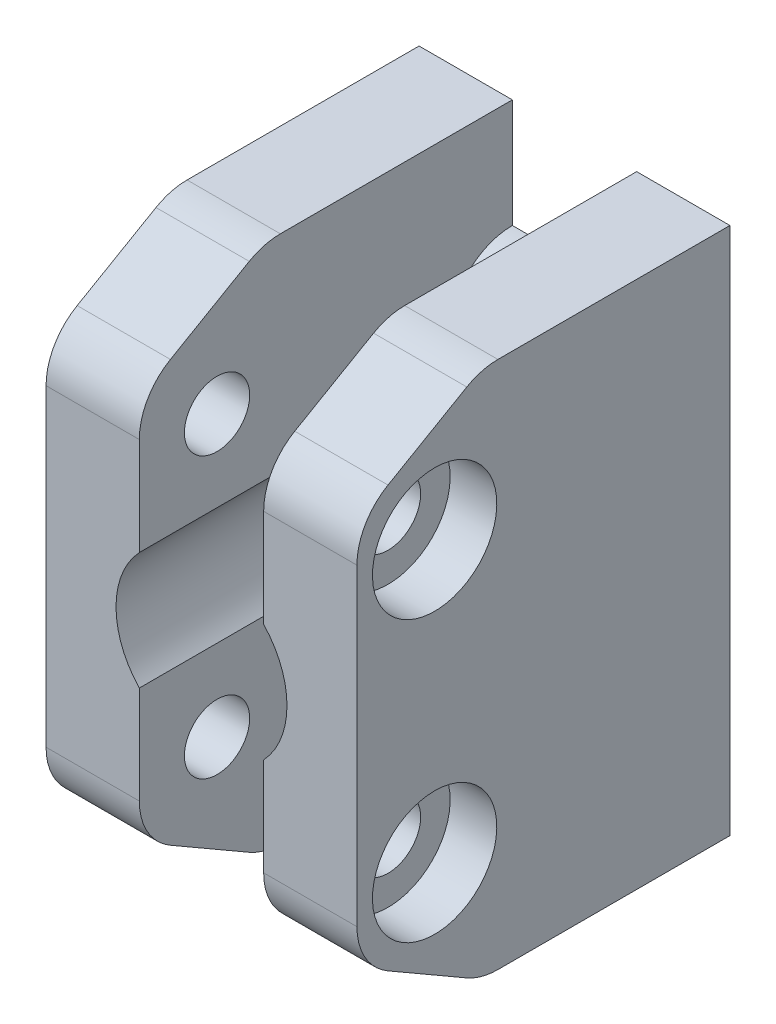
ISO-10303-21;
HEADER;
FILE_DESCRIPTION(('STEP AP214'),'2;1');
FILE_NAME('part.step','',(''),(''),'','','');
FILE_SCHEMA(('AUTOMOTIVE_DESIGN { 1 0 10303 214 1 1 1 1 }'));
ENDSEC;
DATA;
#1=APPLICATION_CONTEXT('core data for automotive mechanical design processes');
#2=APPLICATION_PROTOCOL_DEFINITION('international standard','automotive_design',2000,#1);
#3=PRODUCT_CONTEXT('',#1,'mechanical');
#4=PRODUCT('Part','Part','',(#3));
#5=PRODUCT_RELATED_PRODUCT_CATEGORY('part','',(#4));
#6=PRODUCT_DEFINITION_FORMATION('','',#4);
#7=PRODUCT_DEFINITION_CONTEXT('part definition',#1,'design');
#8=PRODUCT_DEFINITION('design','',#6,#7);
#9=PRODUCT_DEFINITION_SHAPE('','',#8);
#10=(LENGTH_UNIT() NAMED_UNIT(*) SI_UNIT(.MILLI.,.METRE.));
#11=(NAMED_UNIT(*) PLANE_ANGLE_UNIT() SI_UNIT($,.RADIAN.));
#12=(NAMED_UNIT(*) SI_UNIT($,.STERADIAN.) SOLID_ANGLE_UNIT());
#13=UNCERTAINTY_MEASURE_WITH_UNIT(LENGTH_MEASURE(1.E-05),#10,'distance_accuracy_value','');
#14=(GEOMETRIC_REPRESENTATION_CONTEXT(3) GLOBAL_UNCERTAINTY_ASSIGNED_CONTEXT((#13)) GLOBAL_UNIT_ASSIGNED_CONTEXT((#10,
#11,#12)) REPRESENTATION_CONTEXT('',''));
#15=CARTESIAN_POINT('',(0.,0.,0.));
#16=DIRECTION('',(0.,0.,1.));
#17=DIRECTION('',(1.,0.,0.));
#18=AXIS2_PLACEMENT_3D('',#15,#16,#17);
#19=CARTESIAN_POINT('',(-10.,-9.,19.));
#20=DIRECTION('',(1.,0.,0.));
#21=DIRECTION('',(0.,1.,0.));
#22=AXIS2_PLACEMENT_3D('',#19,#20,#21);
#23=CYLINDRICAL_SURFACE('',#22,2.1);
#24=CARTESIAN_POINT('',(4.,-9.,19.));
#25=DIRECTION('',(1.,0.,0.));
#26=DIRECTION('',(0.,1.,0.));
#27=AXIS2_PLACEMENT_3D('',#24,#25,#26);
#28=CIRCLE('',#27,2.1);
#29=CARTESIAN_POINT('',(4.,-6.9,19.));
#30=VERTEX_POINT('',#29);
#31=EDGE_CURVE('E333',#30,#30,#28,.T.);
#32=ORIENTED_EDGE('',*,*,#31,.F.);
#33=EDGE_LOOP('',(#32));
#34=FACE_BOUND('',#33,.T.);
#35=CARTESIAN_POINT('',(7.,-9.,19.));
#36=DIRECTION('',(1.,0.,0.));
#37=DIRECTION('',(0.,1.,0.));
#38=AXIS2_PLACEMENT_3D('',#35,#36,#37);
#39=CIRCLE('',#38,2.1);
#40=CARTESIAN_POINT('',(7.,-6.9,19.));
#41=VERTEX_POINT('',#40);
#42=EDGE_CURVE('E38',#41,#41,#39,.F.);
#43=ORIENTED_EDGE('',*,*,#42,.F.);
#44=EDGE_LOOP('',(#43));
#45=FACE_BOUND('',#44,.T.);
#46=ADVANCED_FACE('F34',(#34,#45),#23,.F.);
#47=CARTESIAN_POINT('',(-10.,9.,19.));
#48=DIRECTION('',(1.,0.,0.));
#49=DIRECTION('',(0.,1.,0.));
#50=AXIS2_PLACEMENT_3D('',#47,#48,#49);
#51=CYLINDRICAL_SURFACE('',#50,2.1);
#52=CARTESIAN_POINT('',(4.,9.,19.));
#53=DIRECTION('',(1.,0.,0.));
#54=DIRECTION('',(0.,1.,0.));
#55=AXIS2_PLACEMENT_3D('',#52,#53,#54);
#56=CIRCLE('',#55,2.1);
#57=CARTESIAN_POINT('',(4.,11.1,19.));
#58=VERTEX_POINT('',#57);
#59=EDGE_CURVE('E329',#58,#58,#56,.T.);
#60=ORIENTED_EDGE('',*,*,#59,.F.);
#61=EDGE_LOOP('',(#60));
#62=FACE_BOUND('',#61,.T.);
#63=CARTESIAN_POINT('',(7.,9.,19.));
#64=DIRECTION('',(1.,0.,0.));
#65=DIRECTION('',(0.,1.,0.));
#66=AXIS2_PLACEMENT_3D('',#63,#64,#65);
#67=CIRCLE('',#66,2.1);
#68=CARTESIAN_POINT('',(7.,11.1,19.));
#69=VERTEX_POINT('',#68);
#70=EDGE_CURVE('E239',#69,#69,#67,.F.);
#71=ORIENTED_EDGE('',*,*,#70,.F.);
#72=EDGE_LOOP('',(#71));
#73=FACE_BOUND('',#72,.T.);
#74=ADVANCED_FACE('F573',(#62,#73),#51,.F.);
#75=CARTESIAN_POINT('',(-4.,17.,0.));
#76=DIRECTION('',(-1.,0.,0.));
#77=DIRECTION('',(0.,0.,1.));
#78=AXIS2_PLACEMENT_3D('',#75,#76,#77);
#79=PLANE('',#78);
#80=CARTESIAN_POINT('',(-4.,9.,19.));
#81=DIRECTION('',(-1.,0.,0.));
#82=DIRECTION('',(0.,0.,1.));
#83=AXIS2_PLACEMENT_3D('',#80,#81,#82);
#84=CIRCLE('',#83,2.1);
#85=CARTESIAN_POINT('',(-4.,9.,21.1));
#86=VERTEX_POINT('',#85);
#87=EDGE_CURVE('E249',#86,#86,#84,.T.);
#88=ORIENTED_EDGE('',*,*,#87,.T.);
#89=EDGE_LOOP('',(#88));
#90=FACE_BOUND('',#89,.T.);
#91=DIRECTION('',(0.,0.,-1.));
#92=VECTOR('',#91,1.);
#93=CARTESIAN_POINT('',(-4.,3.77491721763537,24.));
#94=LINE('',#93,#92);
#95=CARTESIAN_POINT('',(-4.,3.77491721763537,4.));
#96=VERTEX_POINT('',#95);
#97=CARTESIAN_POINT('',(-4.,3.77491721763537,24.));
#98=VERTEX_POINT('',#97);
#99=EDGE_CURVE('E51',#96,#98,#94,.F.);
#100=ORIENTED_EDGE('',*,*,#99,.F.);
#101=DIRECTION('',(0.,1.,0.));
#102=VECTOR('',#101,1.);
#103=CARTESIAN_POINT('',(-4.,17.,4.));
#104=LINE('',#103,#102);
#105=CARTESIAN_POINT('',(-4.,6.,4.));
#106=VERTEX_POINT('',#105);
#107=EDGE_CURVE('E264',#96,#106,#104,.T.);
#108=ORIENTED_EDGE('',*,*,#107,.T.);
#109=CARTESIAN_POINT('',(-4.,6.,0.));
#110=DIRECTION('',(-1.,0.,0.));
#111=DIRECTION('',(0.,0.,1.));
#112=AXIS2_PLACEMENT_3D('',#109,#110,#111);
#113=CIRCLE('',#112,4.);
#114=CARTESIAN_POINT('',(-4.,10.,0.));
#115=VERTEX_POINT('',#114);
#116=EDGE_CURVE('E326',#106,#115,#113,.T.);
#117=ORIENTED_EDGE('',*,*,#116,.T.);
#118=DIRECTION('',(0.,-1.,0.));
#119=VECTOR('',#118,1.);
#120=CARTESIAN_POINT('',(-4.,17.,0.));
#121=LINE('',#120,#119);
#122=CARTESIAN_POINT('',(-4.,17.,0.));
#123=VERTEX_POINT('',#122);
#124=EDGE_CURVE('E277',#123,#115,#121,.T.);
#125=ORIENTED_EDGE('',*,*,#124,.F.);
#126=DIRECTION('',(0.,0.,1.));
#127=VECTOR('',#126,1.);
#128=CARTESIAN_POINT('',(-4.,17.,0.));
#129=LINE('',#128,#127);
#130=CARTESIAN_POINT('',(-4.,17.,14.9282032302755));
#131=VERTEX_POINT('',#130);
#132=EDGE_CURVE('E289',#123,#131,#129,.T.);
#133=ORIENTED_EDGE('',*,*,#132,.T.);
#134=CARTESIAN_POINT('',(-4.,13.,14.9282032302755));
#135=DIRECTION('',(-1.,0.,0.));
#136=DIRECTION('',(0.,0.,1.));
#137=AXIS2_PLACEMENT_3D('',#134,#135,#136);
#138=CIRCLE('',#137,4.);
#139=CARTESIAN_POINT('',(-4.,16.4641016151378,16.9282032302754));
#140=VERTEX_POINT('',#139);
#141=EDGE_CURVE('E395',#131,#140,#138,.F.);
#142=ORIENTED_EDGE('',*,*,#141,.T.);
#143=DIRECTION('',(0.,-0.499999999999998,0.86602540378444));
#144=VECTOR('',#143,1.);
#145=CARTESIAN_POINT('',(-4.,12.381197846483,24.));
#146=LINE('',#145,#144);
#147=CARTESIAN_POINT('',(-4.,13.5358983848622,22.));
#148=VERTEX_POINT('',#147);
#149=EDGE_CURVE('E328',#140,#148,#146,.T.);
#150=ORIENTED_EDGE('',*,*,#149,.T.);
#151=CARTESIAN_POINT('',(-4.,10.0717967697245,20.));
#152=DIRECTION('',(-1.,0.,0.));
#153=DIRECTION('',(0.,0.,1.));
#154=AXIS2_PLACEMENT_3D('',#151,#152,#153);
#155=CIRCLE('',#154,4.);
#156=CARTESIAN_POINT('',(-4.,10.0717967697245,24.));
#157=VERTEX_POINT('',#156);
#158=EDGE_CURVE('E392',#148,#157,#155,.F.);
#159=ORIENTED_EDGE('',*,*,#158,.T.);
#160=DIRECTION('',(0.,1.,0.));
#161=VECTOR('',#160,1.);
#162=CARTESIAN_POINT('',(-4.,17.,24.));
#163=LINE('',#162,#161);
#164=EDGE_CURVE('E256',#98,#157,#163,.T.);
#165=ORIENTED_EDGE('',*,*,#164,.F.);
#166=EDGE_LOOP('',(#100,#108,#117,#125,#133,#142,#150,#159,#165));
#167=FACE_BOUND('',#166,.T.);
#168=ADVANCED_FACE('F472',(#90,#167),#79,.F.);
#169=CARTESIAN_POINT('',(-4.,-9.,19.));
#170=DIRECTION('',(-1.,0.,0.));
#171=DIRECTION('',(0.,0.,1.));
#172=AXIS2_PLACEMENT_3D('',#169,#170,#171);
#173=CIRCLE('',#172,2.1);
#174=CARTESIAN_POINT('',(-4.,-9.,21.1));
#175=VERTEX_POINT('',#174);
#176=EDGE_CURVE('E336',#175,#175,#173,.T.);
#177=ORIENTED_EDGE('',*,*,#176,.T.);
#178=EDGE_LOOP('',(#177));
#179=FACE_BOUND('',#178,.T.);
#180=DIRECTION('',(0.,0.,-1.));
#181=VECTOR('',#180,1.);
#182=CARTESIAN_POINT('',(-4.,-3.77491721763537,24.));
#183=LINE('',#182,#181);
#184=CARTESIAN_POINT('',(-4.,-3.77491721763537,24.));
#185=VERTEX_POINT('',#184);
#186=CARTESIAN_POINT('',(-4.,-3.77491721763537,4.));
#187=VERTEX_POINT('',#186);
#188=EDGE_CURVE('E450',#185,#187,#183,.T.);
#189=ORIENTED_EDGE('',*,*,#188,.F.);
#190=CARTESIAN_POINT('',(-4.,-10.0717967697245,24.));
#191=VERTEX_POINT('',#190);
#192=EDGE_CURVE('E258',#191,#185,#163,.T.);
#193=ORIENTED_EDGE('',*,*,#192,.F.);
#194=CARTESIAN_POINT('',(-4.,-10.0717967697245,20.));
#195=DIRECTION('',(-1.,0.,0.));
#196=DIRECTION('',(0.,0.,1.));
#197=AXIS2_PLACEMENT_3D('',#194,#195,#196);
#198=CIRCLE('',#197,4.);
#199=CARTESIAN_POINT('',(-4.,-13.5358983848622,22.));
#200=VERTEX_POINT('',#199);
#201=EDGE_CURVE('E388',#191,#200,#198,.F.);
#202=ORIENTED_EDGE('',*,*,#201,.T.);
#203=DIRECTION('',(0.,-0.499999999999998,-0.86602540378444));
#204=VECTOR('',#203,1.);
#205=CARTESIAN_POINT('',(-4.,-12.381197846483,24.));
#206=LINE('',#205,#204);
#207=CARTESIAN_POINT('',(-4.,-16.4641016151378,16.9282032302754));
#208=VERTEX_POINT('',#207);
#209=EDGE_CURVE('E340',#200,#208,#206,.T.);
#210=ORIENTED_EDGE('',*,*,#209,.T.);
#211=CARTESIAN_POINT('',(-4.,-13.,14.9282032302755));
#212=DIRECTION('',(-1.,0.,0.));
#213=DIRECTION('',(0.,0.,1.));
#214=AXIS2_PLACEMENT_3D('',#211,#212,#213);
#215=CIRCLE('',#214,4.);
#216=CARTESIAN_POINT('',(-4.,-17.,14.9282032302755));
#217=VERTEX_POINT('',#216);
#218=EDGE_CURVE('E390',#208,#217,#215,.F.);
#219=ORIENTED_EDGE('',*,*,#218,.T.);
#220=DIRECTION('',(0.,0.,1.));
#221=VECTOR('',#220,1.);
#222=CARTESIAN_POINT('',(-4.,-17.,0.));
#223=LINE('',#222,#221);
#224=CARTESIAN_POINT('',(-4.,-17.,0.));
#225=VERTEX_POINT('',#224);
#226=EDGE_CURVE('E273',#225,#217,#223,.T.);
#227=ORIENTED_EDGE('',*,*,#226,.F.);
#228=DIRECTION('',(0.,-1.,0.));
#229=VECTOR('',#228,1.);
#230=CARTESIAN_POINT('',(-4.,-17.,0.));
#231=LINE('',#230,#229);
#232=CARTESIAN_POINT('',(-4.,-10.,0.));
#233=VERTEX_POINT('',#232);
#234=EDGE_CURVE('E261',#233,#225,#231,.T.);
#235=ORIENTED_EDGE('',*,*,#234,.F.);
#236=CARTESIAN_POINT('',(-4.,-6.,0.));
#237=DIRECTION('',(-1.,0.,0.));
#238=DIRECTION('',(0.,0.,1.));
#239=AXIS2_PLACEMENT_3D('',#236,#237,#238);
#240=CIRCLE('',#239,4.);
#241=CARTESIAN_POINT('',(-4.,-6.,4.));
#242=VERTEX_POINT('',#241);
#243=EDGE_CURVE('E320',#233,#242,#240,.T.);
#244=ORIENTED_EDGE('',*,*,#243,.T.);
#245=EDGE_CURVE('E257',#242,#187,#104,.T.);
#246=ORIENTED_EDGE('',*,*,#245,.T.);
#247=EDGE_LOOP('',(#189,#193,#202,#210,#219,#227,#235,#244,#246));
#248=FACE_BOUND('',#247,.T.);
#249=ADVANCED_FACE('F509',(#179,#248),#79,.F.);
#250=CARTESIAN_POINT('',(4.,17.,0.));
#251=DIRECTION('',(1.,0.,0.));
#252=DIRECTION('',(0.,1.,0.));
#253=AXIS2_PLACEMENT_3D('',#250,#251,#252);
#254=PLANE('',#253);
#255=ORIENTED_EDGE('',*,*,#31,.T.);
#256=EDGE_LOOP('',(#255));
#257=FACE_BOUND('',#256,.T.);
#258=DIRECTION('',(0.,0.,-1.));
#259=VECTOR('',#258,1.);
#260=CARTESIAN_POINT('',(4.,-3.77491721763537,24.));
#261=LINE('',#260,#259);
#262=CARTESIAN_POINT('',(4.,-3.77491721763537,4.));
#263=VERTEX_POINT('',#262);
#264=CARTESIAN_POINT('',(4.,-3.77491721763537,24.));
#265=VERTEX_POINT('',#264);
#266=EDGE_CURVE('E58',#263,#265,#261,.F.);
#267=ORIENTED_EDGE('',*,*,#266,.F.);
#268=DIRECTION('',(0.,-1.,0.));
#269=VECTOR('',#268,1.);
#270=CARTESIAN_POINT('',(4.,-17.,4.));
#271=LINE('',#270,#269);
#272=CARTESIAN_POINT('',(4.,-6.,4.));
#273=VERTEX_POINT('',#272);
#274=EDGE_CURVE('E237',#263,#273,#271,.T.);
#275=ORIENTED_EDGE('',*,*,#274,.T.);
#276=CARTESIAN_POINT('',(4.,-6.,0.));
#277=DIRECTION('',(1.,0.,0.));
#278=DIRECTION('',(0.,0.,-1.));
#279=AXIS2_PLACEMENT_3D('',#276,#277,#278);
#280=CIRCLE('',#279,4.);
#281=CARTESIAN_POINT('',(4.,-10.,0.));
#282=VERTEX_POINT('',#281);
#283=EDGE_CURVE('E323',#273,#282,#280,.T.);
#284=ORIENTED_EDGE('',*,*,#283,.T.);
#285=DIRECTION('',(0.,1.,0.));
#286=VECTOR('',#285,1.);
#287=CARTESIAN_POINT('',(4.,-17.,0.));
#288=LINE('',#287,#286);
#289=CARTESIAN_POINT('',(4.,-17.,0.));
#290=VERTEX_POINT('',#289);
#291=EDGE_CURVE('E267',#290,#282,#288,.T.);
#292=ORIENTED_EDGE('',*,*,#291,.F.);
#293=DIRECTION('',(0.,0.,1.));
#294=VECTOR('',#293,1.);
#295=CARTESIAN_POINT('',(4.,-17.,0.));
#296=LINE('',#295,#294);
#297=CARTESIAN_POINT('',(4.,-17.,14.9282032302755));
#298=VERTEX_POINT('',#297);
#299=EDGE_CURVE('E274',#290,#298,#296,.T.);
#300=ORIENTED_EDGE('',*,*,#299,.T.);
#301=CARTESIAN_POINT('',(4.,-13.,14.9282032302755));
#302=DIRECTION('',(1.,0.,0.));
#303=DIRECTION('',(0.,1.,0.));
#304=AXIS2_PLACEMENT_3D('',#301,#302,#303);
#305=CIRCLE('',#304,4.);
#306=CARTESIAN_POINT('',(4.,-16.4641016151378,16.9282032302754));
#307=VERTEX_POINT('',#306);
#308=EDGE_CURVE('E376',#298,#307,#305,.F.);
#309=ORIENTED_EDGE('',*,*,#308,.T.);
#310=DIRECTION('',(0.,-0.499999999999998,-0.86602540378444));
#311=VECTOR('',#310,1.);
#312=CARTESIAN_POINT('',(4.,-12.381197846483,24.));
#313=LINE('',#312,#311);
#314=CARTESIAN_POINT('',(4.,-13.5358983848622,22.));
#315=VERTEX_POINT('',#314);
#316=EDGE_CURVE('E358',#307,#315,#313,.F.);
#317=ORIENTED_EDGE('',*,*,#316,.T.);
#318=CARTESIAN_POINT('',(4.,-10.0717967697245,20.));
#319=DIRECTION('',(1.,0.,0.));
#320=DIRECTION('',(0.,1.,0.));
#321=AXIS2_PLACEMENT_3D('',#318,#319,#320);
#322=CIRCLE('',#321,4.);
#323=CARTESIAN_POINT('',(4.,-10.0717967697245,24.));
#324=VERTEX_POINT('',#323);
#325=EDGE_CURVE('E378',#315,#324,#322,.F.);
#326=ORIENTED_EDGE('',*,*,#325,.T.);
#327=DIRECTION('',(0.,-1.,0.));
#328=VECTOR('',#327,1.);
#329=CARTESIAN_POINT('',(4.,-17.,24.));
#330=LINE('',#329,#328);
#331=EDGE_CURVE('E245',#265,#324,#330,.T.);
#332=ORIENTED_EDGE('',*,*,#331,.F.);
#333=EDGE_LOOP('',(#267,#275,#284,#292,#300,#309,#317,#326,#332));
#334=FACE_BOUND('',#333,.T.);
#335=ADVANCED_FACE('F517',(#257,#334),#254,.F.);
#336=ORIENTED_EDGE('',*,*,#59,.T.);
#337=EDGE_LOOP('',(#336));
#338=FACE_BOUND('',#337,.T.);
#339=DIRECTION('',(0.,0.,-1.));
#340=VECTOR('',#339,1.);
#341=CARTESIAN_POINT('',(4.,3.77491721763537,24.));
#342=LINE('',#341,#340);
#343=CARTESIAN_POINT('',(4.,3.77491721763537,24.));
#344=VERTEX_POINT('',#343);
#345=CARTESIAN_POINT('',(4.,3.77491721763537,4.));
#346=VERTEX_POINT('',#345);
#347=EDGE_CURVE('E218',#344,#346,#342,.T.);
#348=ORIENTED_EDGE('',*,*,#347,.F.);
#349=CARTESIAN_POINT('',(4.,10.0717967697245,24.));
#350=VERTEX_POINT('',#349);
#351=EDGE_CURVE('E247',#350,#344,#330,.T.);
#352=ORIENTED_EDGE('',*,*,#351,.F.);
#353=CARTESIAN_POINT('',(4.,10.0717967697245,20.));
#354=DIRECTION('',(1.,0.,0.));
#355=DIRECTION('',(0.,1.,0.));
#356=AXIS2_PLACEMENT_3D('',#353,#354,#355);
#357=CIRCLE('',#356,4.);
#358=CARTESIAN_POINT('',(4.,13.5358983848622,22.));
#359=VERTEX_POINT('',#358);
#360=EDGE_CURVE('E381',#350,#359,#357,.F.);
#361=ORIENTED_EDGE('',*,*,#360,.T.);
#362=DIRECTION('',(0.,-0.499999999999998,0.86602540378444));
#363=VECTOR('',#362,1.);
#364=CARTESIAN_POINT('',(4.,12.381197846483,24.));
#365=LINE('',#364,#363);
#366=CARTESIAN_POINT('',(4.,16.4641016151378,16.9282032302754));
#367=VERTEX_POINT('',#366);
#368=EDGE_CURVE('E355',#359,#367,#365,.F.);
#369=ORIENTED_EDGE('',*,*,#368,.T.);
#370=CARTESIAN_POINT('',(4.,13.,14.9282032302755));
#371=DIRECTION('',(1.,0.,0.));
#372=DIRECTION('',(0.,1.,0.));
#373=AXIS2_PLACEMENT_3D('',#370,#371,#372);
#374=CIRCLE('',#373,4.);
#375=CARTESIAN_POINT('',(4.,17.,14.9282032302755));
#376=VERTEX_POINT('',#375);
#377=EDGE_CURVE('E383',#367,#376,#374,.F.);
#378=ORIENTED_EDGE('',*,*,#377,.T.);
#379=DIRECTION('',(0.,0.,1.));
#380=VECTOR('',#379,1.);
#381=CARTESIAN_POINT('',(4.,17.,0.));
#382=LINE('',#381,#380);
#383=CARTESIAN_POINT('',(4.,17.,0.));
#384=VERTEX_POINT('',#383);
#385=EDGE_CURVE('E288',#384,#376,#382,.T.);
#386=ORIENTED_EDGE('',*,*,#385,.F.);
#387=DIRECTION('',(0.,1.,0.));
#388=VECTOR('',#387,1.);
#389=CARTESIAN_POINT('',(4.,17.,0.));
#390=LINE('',#389,#388);
#391=CARTESIAN_POINT('',(4.,10.,0.));
#392=VERTEX_POINT('',#391);
#393=EDGE_CURVE('E285',#392,#384,#390,.T.);
#394=ORIENTED_EDGE('',*,*,#393,.F.);
#395=CARTESIAN_POINT('',(4.,6.,0.));
#396=DIRECTION('',(1.,0.,0.));
#397=DIRECTION('',(0.,1.,0.));
#398=AXIS2_PLACEMENT_3D('',#395,#396,#397);
#399=CIRCLE('',#398,4.);
#400=CARTESIAN_POINT('',(4.,6.,4.));
#401=VERTEX_POINT('',#400);
#402=EDGE_CURVE('E243',#392,#401,#399,.T.);
#403=ORIENTED_EDGE('',*,*,#402,.T.);
#404=EDGE_CURVE('E234',#401,#346,#271,.T.);
#405=ORIENTED_EDGE('',*,*,#404,.T.);
#406=EDGE_LOOP('',(#348,#352,#361,#369,#378,#386,#394,#403,#405));
#407=FACE_BOUND('',#406,.T.);
#408=ADVANCED_FACE('F241',(#338,#407),#254,.F.);
#409=CARTESIAN_POINT('',(0.,0.,24.));
#410=DIRECTION('',(0.,0.,1.));
#411=DIRECTION('',(1.,0.,0.));
#412=AXIS2_PLACEMENT_3D('',#409,#410,#411);
#413=PLANE('',#412);
#414=ORIENTED_EDGE('',*,*,#192,.T.);
#415=CARTESIAN_POINT('',(0.,0.,24.));
#416=DIRECTION('',(0.,0.,1.));
#417=DIRECTION('',(1.,0.,0.));
#418=AXIS2_PLACEMENT_3D('',#415,#416,#417);
#419=CIRCLE('',#418,5.5);
#420=EDGE_CURVE('E226',#98,#185,#419,.T.);
#421=ORIENTED_EDGE('',*,*,#420,.F.);
#422=ORIENTED_EDGE('',*,*,#164,.T.);
#423=DIRECTION('',(-1.,0.,0.));
#424=VECTOR('',#423,1.);
#425=CARTESIAN_POINT('',(0.,10.0717967697245,24.));
#426=LINE('',#425,#424);
#427=CARTESIAN_POINT('',(-10.,10.0717967697245,24.));
#428=VERTEX_POINT('',#427);
#429=EDGE_CURVE('E412',#157,#428,#426,.T.);
#430=ORIENTED_EDGE('',*,*,#429,.T.);
#431=DIRECTION('',(0.,-1.,0.));
#432=VECTOR('',#431,1.);
#433=CARTESIAN_POINT('',(-10.,17.,24.));
#434=LINE('',#433,#432);
#435=CARTESIAN_POINT('',(-10.,-10.0717967697245,24.));
#436=VERTEX_POINT('',#435);
#437=EDGE_CURVE('E253',#428,#436,#434,.T.);
#438=ORIENTED_EDGE('',*,*,#437,.T.);
#439=DIRECTION('',(1.,0.,0.));
#440=VECTOR('',#439,1.);
#441=CARTESIAN_POINT('',(0.,-10.0717967697245,24.));
#442=LINE('',#441,#440);
#443=EDGE_CURVE('E409',#436,#191,#442,.T.);
#444=ORIENTED_EDGE('',*,*,#443,.T.);
#445=EDGE_LOOP('',(#414,#421,#422,#430,#438,#444));
#446=FACE_BOUND('',#445,.T.);
#447=ADVANCED_FACE('F503',(#446),#413,.T.);
#448=CARTESIAN_POINT('',(0.,0.,24.));
#449=DIRECTION('',(0.,0.,-1.));
#450=DIRECTION('',(-1.,0.,0.));
#451=AXIS2_PLACEMENT_3D('',#448,#449,#450);
#452=PLANE('',#451);
#453=CARTESIAN_POINT('',(0.,0.,24.));
#454=DIRECTION('',(0.,0.,-1.));
#455=DIRECTION('',(-1.,0.,0.));
#456=AXIS2_PLACEMENT_3D('',#453,#454,#455);
#457=CIRCLE('',#456,5.5);
#458=EDGE_CURVE('E11',#265,#344,#457,.F.);
#459=ORIENTED_EDGE('',*,*,#458,.F.);
#460=ORIENTED_EDGE('',*,*,#331,.T.);
#461=DIRECTION('',(-1.,0.,0.));
#462=VECTOR('',#461,1.);
#463=CARTESIAN_POINT('',(10.,-10.0717967697245,24.));
#464=LINE('',#463,#462);
#465=CARTESIAN_POINT('',(10.,-10.0717967697245,24.));
#466=VERTEX_POINT('',#465);
#467=EDGE_CURVE('E415',#324,#466,#464,.F.);
#468=ORIENTED_EDGE('',*,*,#467,.T.);
#469=DIRECTION('',(0.,1.,0.));
#470=VECTOR('',#469,1.);
#471=CARTESIAN_POINT('',(10.,-17.,24.));
#472=LINE('',#471,#470);
#473=CARTESIAN_POINT('',(10.,10.0717967697245,24.));
#474=VERTEX_POINT('',#473);
#475=EDGE_CURVE('E252',#466,#474,#472,.T.);
#476=ORIENTED_EDGE('',*,*,#475,.T.);
#477=DIRECTION('',(1.,0.,0.));
#478=VECTOR('',#477,1.);
#479=CARTESIAN_POINT('',(4.,10.0717967697245,24.));
#480=LINE('',#479,#478);
#481=EDGE_CURVE('E418',#474,#350,#480,.F.);
#482=ORIENTED_EDGE('',*,*,#481,.T.);
#483=ORIENTED_EDGE('',*,*,#351,.T.);
#484=EDGE_LOOP('',(#459,#460,#468,#476,#482,#483));
#485=FACE_BOUND('',#484,.T.);
#486=ADVANCED_FACE('F543',(#485),#452,.F.);
#487=CARTESIAN_POINT('',(0.,0.,4.));
#488=DIRECTION('',(0.,0.,1.));
#489=DIRECTION('',(1.,0.,0.));
#490=AXIS2_PLACEMENT_3D('',#487,#488,#489);
#491=PLANE('',#490);
#492=CARTESIAN_POINT('',(0.,0.,4.));
#493=DIRECTION('',(0.,0.,1.));
#494=DIRECTION('',(1.,0.,0.));
#495=AXIS2_PLACEMENT_3D('',#492,#493,#494);
#496=CIRCLE('',#495,5.5);
#497=EDGE_CURVE('E238',#96,#187,#496,.T.);
#498=ORIENTED_EDGE('',*,*,#497,.T.);
#499=ORIENTED_EDGE('',*,*,#245,.F.);
#500=DIRECTION('',(-1.,0.,0.));
#501=VECTOR('',#500,1.);
#502=CARTESIAN_POINT('',(4.,-6.,4.));
#503=LINE('',#502,#501);
#504=EDGE_CURVE('E318',#242,#273,#503,.F.);
#505=ORIENTED_EDGE('',*,*,#504,.T.);
#506=ORIENTED_EDGE('',*,*,#274,.F.);
#507=EDGE_CURVE('E221',#263,#346,#496,.T.);
#508=ORIENTED_EDGE('',*,*,#507,.T.);
#509=ORIENTED_EDGE('',*,*,#404,.F.);
#510=DIRECTION('',(1.,0.,0.));
#511=VECTOR('',#510,1.);
#512=CARTESIAN_POINT('',(-4.,6.,4.));
#513=LINE('',#512,#511);
#514=EDGE_CURVE('E316',#401,#106,#513,.F.);
#515=ORIENTED_EDGE('',*,*,#514,.T.);
#516=ORIENTED_EDGE('',*,*,#107,.F.);
#517=EDGE_LOOP('',(#498,#499,#505,#506,#508,#509,#515,#516));
#518=FACE_BOUND('',#517,.T.);
#519=CARTESIAN_POINT('',(0.,0.,4.));
#520=DIRECTION('',(0.,0.,1.));
#521=DIRECTION('',(1.,0.,0.));
#522=AXIS2_PLACEMENT_3D('',#519,#520,#521);
#523=CIRCLE('',#522,3.2);
#524=CARTESIAN_POINT('',(3.2,0.,4.));
#525=VERTEX_POINT('',#524);
#526=EDGE_CURVE('E453',#525,#525,#523,.T.);
#527=ORIENTED_EDGE('',*,*,#526,.F.);
#528=EDGE_LOOP('',(#527));
#529=FACE_BOUND('',#528,.T.);
#530=ADVANCED_FACE('F231',(#518,#529),#491,.T.);
#531=CARTESIAN_POINT('',(-10.,-17.,4.));
#532=DIRECTION('',(0.,1.,0.));
#533=DIRECTION('',(0.,0.,1.));
#534=AXIS2_PLACEMENT_3D('',#531,#532,#533);
#535=PLANE('',#534);
#536=ORIENTED_EDGE('',*,*,#226,.T.);
#537=DIRECTION('',(-1.,0.,0.));
#538=VECTOR('',#537,1.);
#539=CARTESIAN_POINT('',(-10.,-17.,14.9282032302755));
#540=LINE('',#539,#538);
#541=CARTESIAN_POINT('',(-10.,-17.,14.9282032302755));
#542=VERTEX_POINT('',#541);
#543=EDGE_CURVE('E428',#217,#542,#540,.T.);
#544=ORIENTED_EDGE('',*,*,#543,.T.);
#545=DIRECTION('',(0.,0.,-1.));
#546=VECTOR('',#545,1.);
#547=CARTESIAN_POINT('',(-10.,-17.,4.));
#548=LINE('',#547,#546);
#549=CARTESIAN_POINT('',(-10.,-17.,0.));
#550=VERTEX_POINT('',#549);
#551=EDGE_CURVE('E314',#542,#550,#548,.T.);
#552=ORIENTED_EDGE('',*,*,#551,.T.);
#553=DIRECTION('',(1.,0.,0.));
#554=VECTOR('',#553,1.);
#555=CARTESIAN_POINT('',(-10.,-17.,0.));
#556=LINE('',#555,#554);
#557=EDGE_CURVE('E298',#550,#225,#556,.T.);
#558=ORIENTED_EDGE('',*,*,#557,.T.);
#559=EDGE_LOOP('',(#536,#544,#552,#558));
#560=FACE_BOUND('',#559,.T.);
#561=ADVANCED_FACE('F571',(#560),#535,.F.);
#562=CARTESIAN_POINT('',(-10.,17.,4.));
#563=DIRECTION('',(0.,-1.,0.));
#564=DIRECTION('',(0.,0.,-1.));
#565=AXIS2_PLACEMENT_3D('',#562,#563,#564);
#566=PLANE('',#565);
#567=DIRECTION('',(0.,0.,-1.));
#568=VECTOR('',#567,1.);
#569=CARTESIAN_POINT('',(-10.,17.,4.));
#570=LINE('',#569,#568);
#571=CARTESIAN_POINT('',(-10.,17.,14.9282032302755));
#572=VERTEX_POINT('',#571);
#573=CARTESIAN_POINT('',(-10.,17.,0.));
#574=VERTEX_POINT('',#573);
#575=EDGE_CURVE('E308',#572,#574,#570,.T.);
#576=ORIENTED_EDGE('',*,*,#575,.F.);
#577=DIRECTION('',(1.,0.,0.));
#578=VECTOR('',#577,1.);
#579=CARTESIAN_POINT('',(-4.,17.,14.9282032302755));
#580=LINE('',#579,#578);
#581=EDGE_CURVE('E385',#572,#131,#580,.T.);
#582=ORIENTED_EDGE('',*,*,#581,.T.);
#583=ORIENTED_EDGE('',*,*,#132,.F.);
#584=DIRECTION('',(-1.,0.,0.));
#585=VECTOR('',#584,1.);
#586=CARTESIAN_POINT('',(-10.,17.,0.));
#587=LINE('',#586,#585);
#588=EDGE_CURVE('E304',#123,#574,#587,.T.);
#589=ORIENTED_EDGE('',*,*,#588,.T.);
#590=EDGE_LOOP('',(#576,#582,#583,#589));
#591=FACE_BOUND('',#590,.T.);
#592=ADVANCED_FACE('F487',(#591),#566,.F.);
#593=CARTESIAN_POINT('',(-10.,17.,4.));
#594=DIRECTION('',(1.,0.,0.));
#595=DIRECTION('',(0.,1.,0.));
#596=AXIS2_PLACEMENT_3D('',#593,#594,#595);
#597=PLANE('',#596);
#598=CARTESIAN_POINT('',(-10.,-9.,19.));
#599=DIRECTION('',(1.,0.,0.));
#600=DIRECTION('',(0.,1.,0.));
#601=AXIS2_PLACEMENT_3D('',#598,#599,#600);
#602=CIRCLE('',#601,2.1);
#603=CARTESIAN_POINT('',(-10.,-6.9,19.));
#604=VERTEX_POINT('',#603);
#605=EDGE_CURVE('E337',#604,#604,#602,.T.);
#606=ORIENTED_EDGE('',*,*,#605,.T.);
#607=EDGE_LOOP('',(#606));
#608=FACE_BOUND('',#607,.T.);
#609=CARTESIAN_POINT('',(-10.,9.,19.));
#610=DIRECTION('',(1.,0.,0.));
#611=DIRECTION('',(0.,1.,0.));
#612=AXIS2_PLACEMENT_3D('',#609,#610,#611);
#613=CIRCLE('',#612,2.1);
#614=CARTESIAN_POINT('',(-10.,11.1,19.));
#615=VERTEX_POINT('',#614);
#616=EDGE_CURVE('E332',#615,#615,#613,.T.);
#617=ORIENTED_EDGE('',*,*,#616,.T.);
#618=EDGE_LOOP('',(#617));
#619=FACE_BOUND('',#618,.T.);
#620=DIRECTION('',(0.,0.499999999999998,-0.86602540378444));
#621=VECTOR('',#620,1.);
#622=CARTESIAN_POINT('',(-10.,12.381197846483,24.));
#623=LINE('',#622,#621);
#624=CARTESIAN_POINT('',(-10.,13.5358983848622,22.));
#625=VERTEX_POINT('',#624);
#626=CARTESIAN_POINT('',(-10.,16.4641016151378,16.9282032302754));
#627=VERTEX_POINT('',#626);
#628=EDGE_CURVE('E343',#625,#627,#623,.T.);
#629=ORIENTED_EDGE('',*,*,#628,.T.);
#630=CARTESIAN_POINT('',(-10.,13.,14.9282032302755));
#631=DIRECTION('',(1.,0.,0.));
#632=DIRECTION('',(0.,1.,0.));
#633=AXIS2_PLACEMENT_3D('',#630,#631,#632);
#634=CIRCLE('',#633,4.);
#635=EDGE_CURVE('E407',#627,#572,#634,.F.);
#636=ORIENTED_EDGE('',*,*,#635,.T.);
#637=ORIENTED_EDGE('',*,*,#575,.T.);
#638=DIRECTION('',(0.,-1.,0.));
#639=VECTOR('',#638,1.);
#640=CARTESIAN_POINT('',(-10.,17.,0.));
#641=LINE('',#640,#639);
#642=EDGE_CURVE('E292',#574,#550,#641,.T.);
#643=ORIENTED_EDGE('',*,*,#642,.T.);
#644=ORIENTED_EDGE('',*,*,#551,.F.);
#645=CARTESIAN_POINT('',(-10.,-13.,14.9282032302755));
#646=DIRECTION('',(1.,0.,0.));
#647=DIRECTION('',(0.,1.,0.));
#648=AXIS2_PLACEMENT_3D('',#645,#646,#647);
#649=CIRCLE('',#648,4.);
#650=CARTESIAN_POINT('',(-10.,-16.4641016151378,16.9282032302754));
#651=VERTEX_POINT('',#650);
#652=EDGE_CURVE('E403',#542,#651,#649,.F.);
#653=ORIENTED_EDGE('',*,*,#652,.T.);
#654=DIRECTION('',(0.,0.499999999999998,0.86602540378444));
#655=VECTOR('',#654,1.);
#656=CARTESIAN_POINT('',(-10.,-12.381197846483,24.));
#657=LINE('',#656,#655);
#658=CARTESIAN_POINT('',(-10.,-13.5358983848622,22.));
#659=VERTEX_POINT('',#658);
#660=EDGE_CURVE('E346',#651,#659,#657,.T.);
#661=ORIENTED_EDGE('',*,*,#660,.T.);
#662=CARTESIAN_POINT('',(-10.,-10.0717967697245,20.));
#663=DIRECTION('',(1.,0.,0.));
#664=DIRECTION('',(0.,1.,0.));
#665=AXIS2_PLACEMENT_3D('',#662,#663,#664);
#666=CIRCLE('',#665,4.);
#667=EDGE_CURVE('E401',#659,#436,#666,.F.);
#668=ORIENTED_EDGE('',*,*,#667,.T.);
#669=ORIENTED_EDGE('',*,*,#437,.F.);
#670=CARTESIAN_POINT('',(-10.,10.0717967697245,20.));
#671=DIRECTION('',(1.,0.,0.));
#672=DIRECTION('',(0.,1.,0.));
#673=AXIS2_PLACEMENT_3D('',#670,#671,#672);
#674=CIRCLE('',#673,4.);
#675=EDGE_CURVE('E405',#428,#625,#674,.F.);
#676=ORIENTED_EDGE('',*,*,#675,.T.);
#677=EDGE_LOOP('',(#629,#636,#637,#643,#644,#653,#661,#668,#669,#676));
#678=FACE_BOUND('',#677,.T.);
#679=ADVANCED_FACE('F570',(#608,#619,#678),#597,.F.);
#680=DIRECTION('',(0.,0.,-1.));
#681=VECTOR('',#680,1.);
#682=CARTESIAN_POINT('',(10.,-17.,4.));
#683=LINE('',#682,#681);
#684=CARTESIAN_POINT('',(10.,-17.,14.9282032302755));
#685=VERTEX_POINT('',#684);
#686=CARTESIAN_POINT('',(10.,-17.,0.));
#687=VERTEX_POINT('',#686);
#688=EDGE_CURVE('E312',#685,#687,#683,.T.);
#689=ORIENTED_EDGE('',*,*,#688,.F.);
#690=DIRECTION('',(1.,0.,0.));
#691=VECTOR('',#690,1.);
#692=CARTESIAN_POINT('',(4.,-17.,14.9282032302755));
#693=LINE('',#692,#691);
#694=EDGE_CURVE('E425',#685,#298,#693,.F.);
#695=ORIENTED_EDGE('',*,*,#694,.T.);
#696=ORIENTED_EDGE('',*,*,#299,.F.);
#697=EDGE_CURVE('E297',#290,#687,#556,.T.);
#698=ORIENTED_EDGE('',*,*,#697,.T.);
#699=EDGE_LOOP('',(#689,#695,#696,#698));
#700=FACE_BOUND('',#699,.T.);
#701=ADVANCED_FACE('F524',(#700),#535,.F.);
#702=CARTESIAN_POINT('',(10.,17.,4.));
#703=DIRECTION('',(-1.,0.,0.));
#704=DIRECTION('',(0.,-1.,0.));
#705=AXIS2_PLACEMENT_3D('',#702,#703,#704);
#706=PLANE('',#705);
#707=CARTESIAN_POINT('',(10.,-9.,19.));
#708=DIRECTION('',(1.,0.,0.));
#709=DIRECTION('',(0.,1.,0.));
#710=AXIS2_PLACEMENT_3D('',#707,#708,#709);
#711=CIRCLE('',#710,4.);
#712=CARTESIAN_POINT('',(10.,-5.,19.));
#713=VERTEX_POINT('',#712);
#714=EDGE_CURVE('E445',#713,#713,#711,.T.);
#715=ORIENTED_EDGE('',*,*,#714,.F.);
#716=EDGE_LOOP('',(#715));
#717=FACE_BOUND('',#716,.T.);
#718=CARTESIAN_POINT('',(10.,9.,19.));
#719=DIRECTION('',(1.,0.,0.));
#720=DIRECTION('',(0.,1.,0.));
#721=AXIS2_PLACEMENT_3D('',#718,#719,#720);
#722=CIRCLE('',#721,4.);
#723=CARTESIAN_POINT('',(10.,13.,19.));
#724=VERTEX_POINT('',#723);
#725=EDGE_CURVE('E438',#724,#724,#722,.T.);
#726=ORIENTED_EDGE('',*,*,#725,.F.);
#727=EDGE_LOOP('',(#726));
#728=FACE_BOUND('',#727,.T.);
#729=DIRECTION('',(0.,0.,-1.));
#730=VECTOR('',#729,1.);
#731=CARTESIAN_POINT('',(10.,17.,4.));
#732=LINE('',#731,#730);
#733=CARTESIAN_POINT('',(10.,17.,14.9282032302755));
#734=VERTEX_POINT('',#733);
#735=CARTESIAN_POINT('',(10.,17.,0.));
#736=VERTEX_POINT('',#735);
#737=EDGE_CURVE('E310',#734,#736,#732,.T.);
#738=ORIENTED_EDGE('',*,*,#737,.F.);
#739=CARTESIAN_POINT('',(10.,13.,14.9282032302755));
#740=DIRECTION('',(-1.,0.,0.));
#741=DIRECTION('',(0.,-1.,0.));
#742=AXIS2_PLACEMENT_3D('',#739,#740,#741);
#743=CIRCLE('',#742,4.);
#744=CARTESIAN_POINT('',(10.,16.4641016151378,16.9282032302754));
#745=VERTEX_POINT('',#744);
#746=EDGE_CURVE('E370',#734,#745,#743,.F.);
#747=ORIENTED_EDGE('',*,*,#746,.T.);
#748=DIRECTION('',(0.,0.499999999999998,-0.86602540378444));
#749=VECTOR('',#748,1.);
#750=CARTESIAN_POINT('',(10.,12.381197846483,24.));
#751=LINE('',#750,#749);
#752=CARTESIAN_POINT('',(10.,13.5358983848622,22.));
#753=VERTEX_POINT('',#752);
#754=EDGE_CURVE('E349',#745,#753,#751,.F.);
#755=ORIENTED_EDGE('',*,*,#754,.T.);
#756=CARTESIAN_POINT('',(10.,10.0717967697245,20.));
#757=DIRECTION('',(-1.,0.,0.));
#758=DIRECTION('',(0.,-1.,0.));
#759=AXIS2_PLACEMENT_3D('',#756,#757,#758);
#760=CIRCLE('',#759,4.);
#761=EDGE_CURVE('E368',#753,#474,#760,.F.);
#762=ORIENTED_EDGE('',*,*,#761,.T.);
#763=ORIENTED_EDGE('',*,*,#475,.F.);
#764=CARTESIAN_POINT('',(10.,-10.0717967697245,20.));
#765=DIRECTION('',(-1.,0.,0.));
#766=DIRECTION('',(0.,-1.,0.));
#767=AXIS2_PLACEMENT_3D('',#764,#765,#766);
#768=CIRCLE('',#767,4.);
#769=CARTESIAN_POINT('',(10.,-13.5358983848622,22.));
#770=VERTEX_POINT('',#769);
#771=EDGE_CURVE('E366',#466,#770,#768,.F.);
#772=ORIENTED_EDGE('',*,*,#771,.T.);
#773=DIRECTION('',(0.,0.499999999999998,0.86602540378444));
#774=VECTOR('',#773,1.);
#775=CARTESIAN_POINT('',(10.,-12.381197846483,24.));
#776=LINE('',#775,#774);
#777=CARTESIAN_POINT('',(10.,-16.4641016151378,16.9282032302754));
#778=VERTEX_POINT('',#777);
#779=EDGE_CURVE('E352',#770,#778,#776,.F.);
#780=ORIENTED_EDGE('',*,*,#779,.T.);
#781=CARTESIAN_POINT('',(10.,-13.,14.9282032302755));
#782=DIRECTION('',(-1.,0.,0.));
#783=DIRECTION('',(0.,-1.,0.));
#784=AXIS2_PLACEMENT_3D('',#781,#782,#783);
#785=CIRCLE('',#784,4.);
#786=EDGE_CURVE('E364',#778,#685,#785,.F.);
#787=ORIENTED_EDGE('',*,*,#786,.T.);
#788=ORIENTED_EDGE('',*,*,#688,.T.);
#789=DIRECTION('',(0.,1.,0.));
#790=VECTOR('',#789,1.);
#791=CARTESIAN_POINT('',(10.,17.,0.));
#792=LINE('',#791,#790);
#793=EDGE_CURVE('E301',#687,#736,#792,.T.);
#794=ORIENTED_EDGE('',*,*,#793,.T.);
#795=EDGE_LOOP('',(#738,#747,#755,#762,#763,#772,#780,#787,#788,#794));
#796=FACE_BOUND('',#795,.T.);
#797=ADVANCED_FACE('F538',(#717,#728,#796),#706,.F.);
#798=ORIENTED_EDGE('',*,*,#385,.T.);
#799=DIRECTION('',(-1.,0.,0.));
#800=VECTOR('',#799,1.);
#801=CARTESIAN_POINT('',(10.,17.,14.9282032302755));
#802=LINE('',#801,#800);
#803=EDGE_CURVE('E361',#376,#734,#802,.F.);
#804=ORIENTED_EDGE('',*,*,#803,.T.);
#805=ORIENTED_EDGE('',*,*,#737,.T.);
#806=EDGE_CURVE('E305',#736,#384,#587,.T.);
#807=ORIENTED_EDGE('',*,*,#806,.T.);
#808=EDGE_LOOP('',(#798,#804,#805,#807));
#809=FACE_BOUND('',#808,.T.);
#810=ADVANCED_FACE('F558',(#809),#566,.F.);
#811=CARTESIAN_POINT('',(0.,0.,0.));
#812=DIRECTION('',(0.,0.,1.));
#813=DIRECTION('',(1.,0.,0.));
#814=AXIS2_PLACEMENT_3D('',#811,#812,#813);
#815=PLANE('',#814);
#816=CARTESIAN_POINT('',(0.,0.,0.));
#817=DIRECTION('',(0.,0.,1.));
#818=DIRECTION('',(1.,0.,0.));
#819=AXIS2_PLACEMENT_3D('',#816,#817,#818);
#820=CIRCLE('',#819,3.2);
#821=CARTESIAN_POINT('',(3.2,0.,0.));
#822=VERTEX_POINT('',#821);
#823=EDGE_CURVE('E454',#822,#822,#820,.T.);
#824=ORIENTED_EDGE('',*,*,#823,.T.);
#825=EDGE_LOOP('',(#824));
#826=FACE_BOUND('',#825,.T.);
#827=DIRECTION('',(-1.,0.,0.));
#828=VECTOR('',#827,1.);
#829=CARTESIAN_POINT('',(-4.,-10.,0.));
#830=LINE('',#829,#828);
#831=EDGE_CURVE('E270',#282,#233,#830,.T.);
#832=ORIENTED_EDGE('',*,*,#831,.T.);
#833=ORIENTED_EDGE('',*,*,#234,.T.);
#834=ORIENTED_EDGE('',*,*,#557,.F.);
#835=ORIENTED_EDGE('',*,*,#642,.F.);
#836=ORIENTED_EDGE('',*,*,#588,.F.);
#837=ORIENTED_EDGE('',*,*,#124,.T.);
#838=DIRECTION('',(1.,0.,0.));
#839=VECTOR('',#838,1.);
#840=CARTESIAN_POINT('',(-4.,10.,0.));
#841=LINE('',#840,#839);
#842=EDGE_CURVE('E282',#115,#392,#841,.T.);
#843=ORIENTED_EDGE('',*,*,#842,.T.);
#844=ORIENTED_EDGE('',*,*,#393,.T.);
#845=ORIENTED_EDGE('',*,*,#806,.F.);
#846=ORIENTED_EDGE('',*,*,#793,.F.);
#847=ORIENTED_EDGE('',*,*,#697,.F.);
#848=ORIENTED_EDGE('',*,*,#291,.T.);
#849=EDGE_LOOP('',(#832,#833,#834,#835,#836,#837,#843,#844,#845,#846,#847,#848));
#850=FACE_BOUND('',#849,.T.);
#851=ADVANCED_FACE('F479',(#826,#850),#815,.F.);
#852=CARTESIAN_POINT('',(-4.,-6.,0.));
#853=DIRECTION('',(1.,0.,0.));
#854=DIRECTION('',(0.,0.,-1.));
#855=AXIS2_PLACEMENT_3D('',#852,#853,#854);
#856=CYLINDRICAL_SURFACE('',#855,4.);
#857=ORIENTED_EDGE('',*,*,#283,.F.);
#858=ORIENTED_EDGE('',*,*,#504,.F.);
#859=ORIENTED_EDGE('',*,*,#243,.F.);
#860=ORIENTED_EDGE('',*,*,#831,.F.);
#861=EDGE_LOOP('',(#857,#858,#859,#860));
#862=FACE_BOUND('',#861,.T.);
#863=ADVANCED_FACE('F515',(#862),#856,.T.);
#864=CARTESIAN_POINT('',(-4.,6.,0.));
#865=DIRECTION('',(-1.,0.,0.));
#866=DIRECTION('',(0.,0.,1.));
#867=AXIS2_PLACEMENT_3D('',#864,#865,#866);
#868=CYLINDRICAL_SURFACE('',#867,4.);
#869=ORIENTED_EDGE('',*,*,#116,.F.);
#870=ORIENTED_EDGE('',*,*,#514,.F.);
#871=ORIENTED_EDGE('',*,*,#402,.F.);
#872=ORIENTED_EDGE('',*,*,#842,.F.);
#873=EDGE_LOOP('',(#869,#870,#871,#872));
#874=FACE_BOUND('',#873,.T.);
#875=ADVANCED_FACE('F477',(#874),#868,.T.);
#876=ORIENTED_EDGE('',*,*,#616,.F.);
#877=EDGE_LOOP('',(#876));
#878=FACE_BOUND('',#877,.T.);
#879=ORIENTED_EDGE('',*,*,#87,.F.);
#880=EDGE_LOOP('',(#879));
#881=FACE_BOUND('',#880,.T.);
#882=ADVANCED_FACE('F582',(#878,#881),#51,.F.);
#883=ORIENTED_EDGE('',*,*,#605,.F.);
#884=EDGE_LOOP('',(#883));
#885=FACE_BOUND('',#884,.T.);
#886=ORIENTED_EDGE('',*,*,#176,.F.);
#887=EDGE_LOOP('',(#886));
#888=FACE_BOUND('',#887,.T.);
#889=ADVANCED_FACE('F576',(#885,#888),#23,.F.);
#890=CARTESIAN_POINT('',(0.,-12.381197846483,24.));
#891=DIRECTION('',(0.,-0.86602540378444,0.499999999999998));
#892=DIRECTION('',(-1.,0.,0.));
#893=AXIS2_PLACEMENT_3D('',#890,#891,#892);
#894=PLANE('',#893);
#895=ORIENTED_EDGE('',*,*,#660,.F.);
#896=DIRECTION('',(-1.,0.,0.));
#897=VECTOR('',#896,1.);
#898=CARTESIAN_POINT('',(-4.,-16.4641016151378,16.9282032302755));
#899=LINE('',#898,#897);
#900=EDGE_CURVE('E43',#651,#208,#899,.F.);
#901=ORIENTED_EDGE('',*,*,#900,.T.);
#902=ORIENTED_EDGE('',*,*,#209,.F.);
#903=DIRECTION('',(1.,0.,0.));
#904=VECTOR('',#903,1.);
#905=CARTESIAN_POINT('',(0.,-13.5358983848622,22.));
#906=LINE('',#905,#904);
#907=EDGE_CURVE('E431',#200,#659,#906,.F.);
#908=ORIENTED_EDGE('',*,*,#907,.T.);
#909=EDGE_LOOP('',(#895,#901,#902,#908));
#910=FACE_BOUND('',#909,.T.);
#911=ADVANCED_FACE('F587',(#910),#894,.T.);
#912=CARTESIAN_POINT('',(0.,-12.381197846483,24.));
#913=DIRECTION('',(0.,0.86602540378444,-0.499999999999998));
#914=DIRECTION('',(1.,0.,0.));
#915=AXIS2_PLACEMENT_3D('',#912,#913,#914);
#916=PLANE('',#915);
#917=ORIENTED_EDGE('',*,*,#779,.F.);
#918=DIRECTION('',(1.,0.,0.));
#919=VECTOR('',#918,1.);
#920=CARTESIAN_POINT('',(4.,-13.5358983848622,22.));
#921=LINE('',#920,#919);
#922=EDGE_CURVE('E423',#770,#315,#921,.F.);
#923=ORIENTED_EDGE('',*,*,#922,.T.);
#924=ORIENTED_EDGE('',*,*,#316,.F.);
#925=DIRECTION('',(-1.,0.,0.));
#926=VECTOR('',#925,1.);
#927=CARTESIAN_POINT('',(10.,-16.4641016151378,16.9282032302755));
#928=LINE('',#927,#926);
#929=EDGE_CURVE('E421',#307,#778,#928,.F.);
#930=ORIENTED_EDGE('',*,*,#929,.T.);
#931=EDGE_LOOP('',(#917,#923,#924,#930));
#932=FACE_BOUND('',#931,.T.);
#933=ADVANCED_FACE('F532',(#932),#916,.F.);
#934=CARTESIAN_POINT('',(0.,12.381197846483,24.));
#935=DIRECTION('',(0.,0.86602540378444,0.499999999999998));
#936=DIRECTION('',(1.,0.,0.));
#937=AXIS2_PLACEMENT_3D('',#934,#935,#936);
#938=PLANE('',#937);
#939=ORIENTED_EDGE('',*,*,#149,.F.);
#940=DIRECTION('',(1.,0.,0.));
#941=VECTOR('',#940,1.);
#942=CARTESIAN_POINT('',(-10.,16.4641016151378,16.9282032302755));
#943=LINE('',#942,#941);
#944=EDGE_CURVE('E399',#140,#627,#943,.F.);
#945=ORIENTED_EDGE('',*,*,#944,.T.);
#946=ORIENTED_EDGE('',*,*,#628,.F.);
#947=DIRECTION('',(-1.,0.,0.));
#948=VECTOR('',#947,1.);
#949=CARTESIAN_POINT('',(0.,13.5358983848622,22.));
#950=LINE('',#949,#948);
#951=EDGE_CURVE('E397',#625,#148,#950,.F.);
#952=ORIENTED_EDGE('',*,*,#951,.T.);
#953=EDGE_LOOP('',(#939,#945,#946,#952));
#954=FACE_BOUND('',#953,.T.);
#955=ADVANCED_FACE('F496',(#954),#938,.T.);
#956=CARTESIAN_POINT('',(0.,12.381197846483,24.));
#957=DIRECTION('',(0.,-0.86602540378444,-0.499999999999998));
#958=DIRECTION('',(-1.,0.,0.));
#959=AXIS2_PLACEMENT_3D('',#956,#957,#958);
#960=PLANE('',#959);
#961=ORIENTED_EDGE('',*,*,#754,.F.);
#962=DIRECTION('',(1.,0.,0.));
#963=VECTOR('',#962,1.);
#964=CARTESIAN_POINT('',(4.,16.4641016151378,16.9282032302755));
#965=LINE('',#964,#963);
#966=EDGE_CURVE('E374',#745,#367,#965,.F.);
#967=ORIENTED_EDGE('',*,*,#966,.T.);
#968=ORIENTED_EDGE('',*,*,#368,.F.);
#969=DIRECTION('',(-1.,0.,0.));
#970=VECTOR('',#969,1.);
#971=CARTESIAN_POINT('',(10.,13.5358983848622,22.));
#972=LINE('',#971,#970);
#973=EDGE_CURVE('E372',#359,#753,#972,.F.);
#974=ORIENTED_EDGE('',*,*,#973,.T.);
#975=EDGE_LOOP('',(#961,#967,#968,#974));
#976=FACE_BOUND('',#975,.T.);
#977=ADVANCED_FACE('F552',(#976),#960,.F.);
#978=CARTESIAN_POINT('',(-10.,13.,14.9282032302755));
#979=DIRECTION('',(1.,0.,0.));
#980=DIRECTION('',(0.,0.,-1.));
#981=AXIS2_PLACEMENT_3D('',#978,#979,#980);
#982=CYLINDRICAL_SURFACE('',#981,4.);
#983=ORIENTED_EDGE('',*,*,#377,.F.);
#984=ORIENTED_EDGE('',*,*,#966,.F.);
#985=ORIENTED_EDGE('',*,*,#746,.F.);
#986=ORIENTED_EDGE('',*,*,#803,.F.);
#987=EDGE_LOOP('',(#983,#984,#985,#986));
#988=FACE_BOUND('',#987,.T.);
#989=ADVANCED_FACE('F555',(#988),#982,.T.);
#990=CARTESIAN_POINT('',(-10.,13.,14.9282032302755));
#991=DIRECTION('',(-1.,0.,0.));
#992=DIRECTION('',(0.,0.,1.));
#993=AXIS2_PLACEMENT_3D('',#990,#991,#992);
#994=CYLINDRICAL_SURFACE('',#993,4.);
#995=ORIENTED_EDGE('',*,*,#635,.F.);
#996=ORIENTED_EDGE('',*,*,#944,.F.);
#997=ORIENTED_EDGE('',*,*,#141,.F.);
#998=ORIENTED_EDGE('',*,*,#581,.F.);
#999=EDGE_LOOP('',(#995,#996,#997,#998));
#1000=FACE_BOUND('',#999,.T.);
#1001=ADVANCED_FACE('F491',(#1000),#994,.T.);
#1002=CARTESIAN_POINT('',(0.,10.0717967697245,20.));
#1003=DIRECTION('',(-1.,0.,0.));
#1004=DIRECTION('',(0.,0.,1.));
#1005=AXIS2_PLACEMENT_3D('',#1002,#1003,#1004);
#1006=CYLINDRICAL_SURFACE('',#1005,4.);
#1007=ORIENTED_EDGE('',*,*,#158,.F.);
#1008=ORIENTED_EDGE('',*,*,#951,.F.);
#1009=ORIENTED_EDGE('',*,*,#675,.F.);
#1010=ORIENTED_EDGE('',*,*,#429,.F.);
#1011=EDGE_LOOP('',(#1007,#1008,#1009,#1010));
#1012=FACE_BOUND('',#1011,.T.);
#1013=ADVANCED_FACE('F500',(#1012),#1006,.T.);
#1014=CARTESIAN_POINT('',(0.,10.0717967697245,20.));
#1015=DIRECTION('',(-1.,0.,0.));
#1016=DIRECTION('',(0.,0.,1.));
#1017=AXIS2_PLACEMENT_3D('',#1014,#1015,#1016);
#1018=CYLINDRICAL_SURFACE('',#1017,4.);
#1019=ORIENTED_EDGE('',*,*,#761,.F.);
#1020=ORIENTED_EDGE('',*,*,#973,.F.);
#1021=ORIENTED_EDGE('',*,*,#360,.F.);
#1022=ORIENTED_EDGE('',*,*,#481,.F.);
#1023=EDGE_LOOP('',(#1019,#1020,#1021,#1022));
#1024=FACE_BOUND('',#1023,.T.);
#1025=ADVANCED_FACE('F548',(#1024),#1018,.T.);
#1026=CARTESIAN_POINT('',(0.,-10.0717967697245,20.));
#1027=DIRECTION('',(1.,0.,0.));
#1028=DIRECTION('',(0.,0.,-1.));
#1029=AXIS2_PLACEMENT_3D('',#1026,#1027,#1028);
#1030=CYLINDRICAL_SURFACE('',#1029,4.);
#1031=ORIENTED_EDGE('',*,*,#325,.F.);
#1032=ORIENTED_EDGE('',*,*,#922,.F.);
#1033=ORIENTED_EDGE('',*,*,#771,.F.);
#1034=ORIENTED_EDGE('',*,*,#467,.F.);
#1035=EDGE_LOOP('',(#1031,#1032,#1033,#1034));
#1036=FACE_BOUND('',#1035,.T.);
#1037=ADVANCED_FACE('F540',(#1036),#1030,.T.);
#1038=CARTESIAN_POINT('',(-10.,-13.,14.9282032302755));
#1039=DIRECTION('',(-1.,0.,0.));
#1040=DIRECTION('',(0.,0.,1.));
#1041=AXIS2_PLACEMENT_3D('',#1038,#1039,#1040);
#1042=CYLINDRICAL_SURFACE('',#1041,4.);
#1043=ORIENTED_EDGE('',*,*,#786,.F.);
#1044=ORIENTED_EDGE('',*,*,#929,.F.);
#1045=ORIENTED_EDGE('',*,*,#308,.F.);
#1046=ORIENTED_EDGE('',*,*,#694,.F.);
#1047=EDGE_LOOP('',(#1043,#1044,#1045,#1046));
#1048=FACE_BOUND('',#1047,.T.);
#1049=ADVANCED_FACE('F535',(#1048),#1042,.T.);
#1050=CARTESIAN_POINT('',(-10.,-13.,14.9282032302755));
#1051=DIRECTION('',(1.,0.,0.));
#1052=DIRECTION('',(0.,0.,-1.));
#1053=AXIS2_PLACEMENT_3D('',#1050,#1051,#1052);
#1054=CYLINDRICAL_SURFACE('',#1053,4.);
#1055=ORIENTED_EDGE('',*,*,#218,.F.);
#1056=ORIENTED_EDGE('',*,*,#900,.F.);
#1057=ORIENTED_EDGE('',*,*,#652,.F.);
#1058=ORIENTED_EDGE('',*,*,#543,.F.);
#1059=EDGE_LOOP('',(#1055,#1056,#1057,#1058));
#1060=FACE_BOUND('',#1059,.T.);
#1061=ADVANCED_FACE('F679',(#1060),#1054,.T.);
#1062=CARTESIAN_POINT('',(0.,-10.0717967697245,20.));
#1063=DIRECTION('',(1.,0.,0.));
#1064=DIRECTION('',(0.,0.,-1.));
#1065=AXIS2_PLACEMENT_3D('',#1062,#1063,#1064);
#1066=CYLINDRICAL_SURFACE('',#1065,4.);
#1067=ORIENTED_EDGE('',*,*,#667,.F.);
#1068=ORIENTED_EDGE('',*,*,#907,.F.);
#1069=ORIENTED_EDGE('',*,*,#201,.F.);
#1070=ORIENTED_EDGE('',*,*,#443,.F.);
#1071=EDGE_LOOP('',(#1067,#1068,#1069,#1070));
#1072=FACE_BOUND('',#1071,.T.);
#1073=ADVANCED_FACE('F36',(#1072),#1066,.T.);
#1074=CARTESIAN_POINT('',(0.,0.,0.));
#1075=DIRECTION('',(0.,0.,1.));
#1076=DIRECTION('',(1.,0.,0.));
#1077=AXIS2_PLACEMENT_3D('',#1074,#1075,#1076);
#1078=CYLINDRICAL_SURFACE('',#1077,3.2);
#1079=ORIENTED_EDGE('',*,*,#823,.F.);
#1080=EDGE_LOOP('',(#1079));
#1081=FACE_BOUND('',#1080,.T.);
#1082=ORIENTED_EDGE('',*,*,#526,.T.);
#1083=EDGE_LOOP('',(#1082));
#1084=FACE_BOUND('',#1083,.T.);
#1085=ADVANCED_FACE('F655',(#1081,#1084),#1078,.F.);
#1086=CARTESIAN_POINT('',(0.,0.,24.));
#1087=DIRECTION('',(0.,0.,-1.));
#1088=DIRECTION('',(-1.,0.,0.));
#1089=AXIS2_PLACEMENT_3D('',#1086,#1087,#1088);
#1090=CYLINDRICAL_SURFACE('',#1089,5.5);
#1091=ORIENTED_EDGE('',*,*,#266,.T.);
#1092=ORIENTED_EDGE('',*,*,#458,.T.);
#1093=ORIENTED_EDGE('',*,*,#347,.T.);
#1094=ORIENTED_EDGE('',*,*,#507,.F.);
#1095=EDGE_LOOP('',(#1091,#1092,#1093,#1094));
#1096=FACE_BOUND('',#1095,.T.);
#1097=ADVANCED_FACE('F220',(#1096),#1090,.F.);
#1098=ORIENTED_EDGE('',*,*,#99,.T.);
#1099=ORIENTED_EDGE('',*,*,#420,.T.);
#1100=ORIENTED_EDGE('',*,*,#188,.T.);
#1101=ORIENTED_EDGE('',*,*,#497,.F.);
#1102=EDGE_LOOP('',(#1098,#1099,#1100,#1101));
#1103=FACE_BOUND('',#1102,.T.);
#1104=ADVANCED_FACE('F507',(#1103),#1090,.F.);
#1105=CARTESIAN_POINT('',(7.,9.,19.));
#1106=DIRECTION('',(1.,0.,0.));
#1107=DIRECTION('',(0.,1.,0.));
#1108=AXIS2_PLACEMENT_3D('',#1105,#1106,#1107);
#1109=PLANE('',#1108);
#1110=CARTESIAN_POINT('',(7.,9.,19.));
#1111=DIRECTION('',(1.,0.,0.));
#1112=DIRECTION('',(0.,1.,0.));
#1113=AXIS2_PLACEMENT_3D('',#1110,#1111,#1112);
#1114=CIRCLE('',#1113,4.);
#1115=CARTESIAN_POINT('',(7.,13.,19.));
#1116=VERTEX_POINT('',#1115);
#1117=EDGE_CURVE('E434',#1116,#1116,#1114,.T.);
#1118=ORIENTED_EDGE('',*,*,#1117,.T.);
#1119=EDGE_LOOP('',(#1118));
#1120=FACE_BOUND('',#1119,.T.);
#1121=ORIENTED_EDGE('',*,*,#70,.T.);
#1122=EDGE_LOOP('',(#1121));
#1123=FACE_BOUND('',#1122,.T.);
#1124=ADVANCED_FACE('F852',(#1120,#1123),#1109,.T.);
#1125=CARTESIAN_POINT('',(7.,9.,19.));
#1126=DIRECTION('',(1.,0.,0.));
#1127=DIRECTION('',(0.,1.,0.));
#1128=AXIS2_PLACEMENT_3D('',#1125,#1126,#1127);
#1129=CYLINDRICAL_SURFACE('',#1128,4.);
#1130=ORIENTED_EDGE('',*,*,#1117,.F.);
#1131=EDGE_LOOP('',(#1130));
#1132=FACE_BOUND('',#1131,.T.);
#1133=ORIENTED_EDGE('',*,*,#725,.T.);
#1134=EDGE_LOOP('',(#1133));
#1135=FACE_BOUND('',#1134,.T.);
#1136=ADVANCED_FACE('F869',(#1132,#1135),#1129,.F.);
#1137=CARTESIAN_POINT('',(7.,-9.,19.));
#1138=DIRECTION('',(1.,0.,0.));
#1139=DIRECTION('',(0.,1.,0.));
#1140=AXIS2_PLACEMENT_3D('',#1137,#1138,#1139);
#1141=PLANE('',#1140);
#1142=CARTESIAN_POINT('',(7.,-9.,19.));
#1143=DIRECTION('',(1.,0.,0.));
#1144=DIRECTION('',(0.,1.,0.));
#1145=AXIS2_PLACEMENT_3D('',#1142,#1143,#1144);
#1146=CIRCLE('',#1145,4.);
#1147=CARTESIAN_POINT('',(7.,-5.,19.));
#1148=VERTEX_POINT('',#1147);
#1149=EDGE_CURVE('E906',#1148,#1148,#1146,.T.);
#1150=ORIENTED_EDGE('',*,*,#1149,.T.);
#1151=EDGE_LOOP('',(#1150));
#1152=FACE_BOUND('',#1151,.T.);
#1153=ORIENTED_EDGE('',*,*,#42,.T.);
#1154=EDGE_LOOP('',(#1153));
#1155=FACE_BOUND('',#1154,.T.);
#1156=ADVANCED_FACE('F877',(#1152,#1155),#1141,.T.);
#1157=CARTESIAN_POINT('',(7.,-9.,19.));
#1158=DIRECTION('',(1.,0.,0.));
#1159=DIRECTION('',(0.,1.,0.));
#1160=AXIS2_PLACEMENT_3D('',#1157,#1158,#1159);
#1161=CYLINDRICAL_SURFACE('',#1160,4.);
#1162=ORIENTED_EDGE('',*,*,#1149,.F.);
#1163=EDGE_LOOP('',(#1162));
#1164=FACE_BOUND('',#1163,.T.);
#1165=ORIENTED_EDGE('',*,*,#714,.T.);
#1166=EDGE_LOOP('',(#1165));
#1167=FACE_BOUND('',#1166,.T.);
#1168=ADVANCED_FACE('F886',(#1164,#1167),#1161,.F.);
#1169=CLOSED_SHELL('',(#46,#74,#168,#249,#335,#408,#447,#486,#530,#561,#592,#679,#701,#797,#810,
#851,#863,#875,#882,#889,#911,#933,#955,#977,#989,#1001,#1013,#1025,#1037,#1049,#1061,#1073,
#1085,#1097,#1104,#1124,#1136,#1156,#1168));
#1170=MANIFOLD_SOLID_BREP('B2',#1169);
#1171=ADVANCED_BREP_SHAPE_REPRESENTATION('',(#18,#1170),#14);
#1172=SHAPE_DEFINITION_REPRESENTATION(#9,#1171);
ENDSEC;
END-ISO-10303-21;
